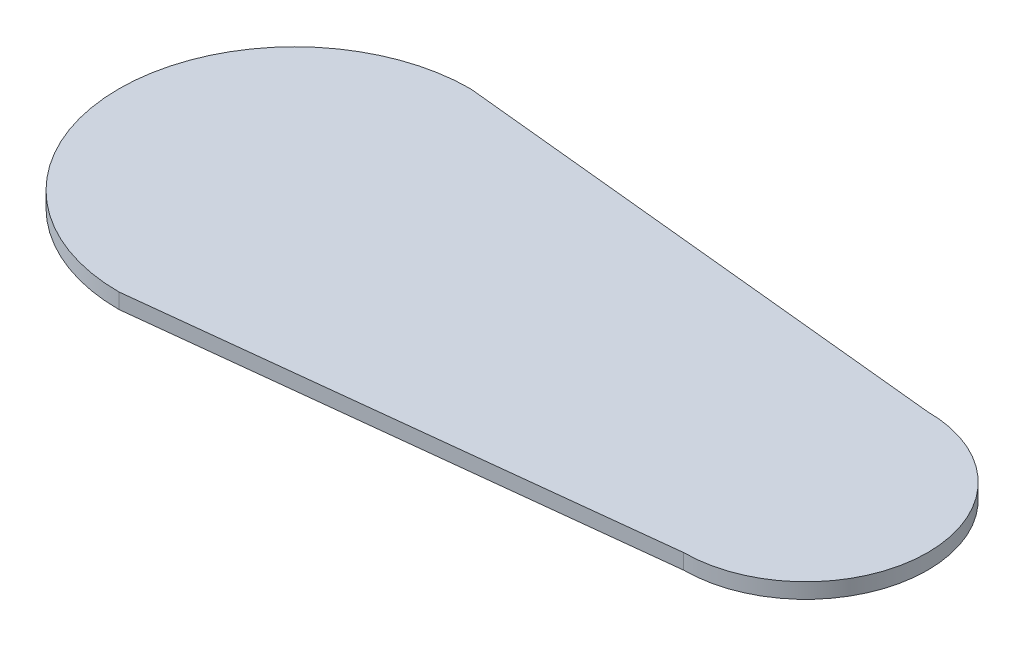
ISO-10303-21;
HEADER;
FILE_DESCRIPTION(('STEP AP214'),'2;1');
FILE_NAME('part.step','',(''),(''),'','','');
FILE_SCHEMA(('AUTOMOTIVE_DESIGN { 1 0 10303 214 1 1 1 1 }'));
ENDSEC;
DATA;
#1=APPLICATION_CONTEXT('core data for automotive mechanical design processes');
#2=APPLICATION_PROTOCOL_DEFINITION('international standard','automotive_design',2000,#1);
#3=PRODUCT_CONTEXT('',#1,'mechanical');
#4=PRODUCT('Part','Part','',(#3));
#5=PRODUCT_RELATED_PRODUCT_CATEGORY('part','',(#4));
#6=PRODUCT_DEFINITION_FORMATION('','',#4);
#7=PRODUCT_DEFINITION_CONTEXT('part definition',#1,'design');
#8=PRODUCT_DEFINITION('design','',#6,#7);
#9=PRODUCT_DEFINITION_SHAPE('','',#8);
#10=(LENGTH_UNIT() NAMED_UNIT(*) SI_UNIT(.MILLI.,.METRE.));
#11=(NAMED_UNIT(*) PLANE_ANGLE_UNIT() SI_UNIT($,.RADIAN.));
#12=(NAMED_UNIT(*) SI_UNIT($,.STERADIAN.) SOLID_ANGLE_UNIT());
#13=UNCERTAINTY_MEASURE_WITH_UNIT(LENGTH_MEASURE(1.E-05),#10,'distance_accuracy_value','');
#14=(GEOMETRIC_REPRESENTATION_CONTEXT(3) GLOBAL_UNCERTAINTY_ASSIGNED_CONTEXT((#13)) GLOBAL_UNIT_ASSIGNED_CONTEXT((#10,
#11,#12)) REPRESENTATION_CONTEXT('',''));
#15=CARTESIAN_POINT('',(0.,0.,0.));
#16=DIRECTION('',(0.,0.,1.));
#17=DIRECTION('',(1.,0.,0.));
#18=AXIS2_PLACEMENT_3D('',#15,#16,#17);
#19=CARTESIAN_POINT('',(0.,3.,-24.));
#20=DIRECTION('',(0.,-1.,0.));
#21=DIRECTION('',(0.,0.,-1.));
#22=AXIS2_PLACEMENT_3D('',#19,#20,#21);
#23=CYLINDRICAL_SURFACE('',#22,24.);
#24=CARTESIAN_POINT('',(0.,0.,-24.));
#25=DIRECTION('',(0.,1.,0.));
#26=DIRECTION('',(0.,0.,-1.));
#27=AXIS2_PLACEMENT_3D('',#24,#25,#26);
#28=CIRCLE('',#27,24.);
#29=CARTESIAN_POINT('',(0.,0.,0.));
#30=VERTEX_POINT('',#29);
#31=CARTESIAN_POINT('',(0.,0.,-48.));
#32=VERTEX_POINT('',#31);
#33=EDGE_CURVE('E96',#30,#32,#28,.T.);
#34=ORIENTED_EDGE('',*,*,#33,.T.);
#35=DIRECTION('',(0.,-1.,0.));
#36=VECTOR('',#35,1.);
#37=CARTESIAN_POINT('',(0.,3.,-48.));
#38=LINE('',#37,#36);
#39=CARTESIAN_POINT('',(0.,3.,-48.));
#40=VERTEX_POINT('',#39);
#41=EDGE_CURVE('E11',#40,#32,#38,.T.);
#42=ORIENTED_EDGE('',*,*,#41,.F.);
#43=CARTESIAN_POINT('',(0.,3.,-24.));
#44=DIRECTION('',(0.,1.,0.));
#45=DIRECTION('',(0.,0.,-1.));
#46=AXIS2_PLACEMENT_3D('',#43,#44,#45);
#47=CIRCLE('',#46,24.);
#48=CARTESIAN_POINT('',(0.,3.,0.));
#49=VERTEX_POINT('',#48);
#50=EDGE_CURVE('E84',#49,#40,#47,.T.);
#51=ORIENTED_EDGE('',*,*,#50,.F.);
#52=DIRECTION('',(0.,-1.,0.));
#53=VECTOR('',#52,1.);
#54=CARTESIAN_POINT('',(0.,3.,0.));
#55=LINE('',#54,#53);
#56=EDGE_CURVE('E92',#49,#30,#55,.T.);
#57=ORIENTED_EDGE('',*,*,#56,.T.);
#58=EDGE_LOOP('',(#34,#42,#51,#57));
#59=FACE_BOUND('',#58,.T.);
#60=ADVANCED_FACE('F33',(#59),#23,.T.);
#61=CARTESIAN_POINT('',(-100.,3.,-58.0615795313177));
#62=DIRECTION('',(-0.10011033594273,0.,0.994976341747599));
#63=DIRECTION('',(0.994976341747599,0.,0.10011033594273));
#64=AXIS2_PLACEMENT_3D('',#61,#62,#63);
#65=PLANE('',#64);
#66=DIRECTION('',(-0.994976341747598,0.,-0.10011033594273));
#67=VECTOR('',#66,1.);
#68=CARTESIAN_POINT('',(-100.,0.,-58.0615795313177));
#69=LINE('',#68,#67);
#70=CARTESIAN_POINT('',(-100.,0.,-58.0615795313177));
#71=VERTEX_POINT('',#70);
#72=EDGE_CURVE('E88',#32,#71,#69,.T.);
#73=ORIENTED_EDGE('',*,*,#72,.T.);
#74=DIRECTION('',(0.,-1.,0.));
#75=VECTOR('',#74,1.);
#76=CARTESIAN_POINT('',(-100.,3.,-58.0615795313177));
#77=LINE('',#76,#75);
#78=CARTESIAN_POINT('',(-100.,3.,-58.0615795313177));
#79=VERTEX_POINT('',#78);
#80=EDGE_CURVE('E41',#79,#71,#77,.T.);
#81=ORIENTED_EDGE('',*,*,#80,.F.);
#82=DIRECTION('',(-0.994976341747598,0.,-0.10011033594273));
#83=VECTOR('',#82,1.);
#84=CARTESIAN_POINT('',(-100.,3.,-58.0615795313177));
#85=LINE('',#84,#83);
#86=EDGE_CURVE('E79',#40,#79,#85,.T.);
#87=ORIENTED_EDGE('',*,*,#86,.F.);
#88=ORIENTED_EDGE('',*,*,#41,.T.);
#89=EDGE_LOOP('',(#73,#81,#87,#88));
#90=FACE_BOUND('',#89,.T.);
#91=ADVANCED_FACE('F87',(#90),#65,.F.);
#92=CARTESIAN_POINT('',(-100.,3.,-23.4579039810428));
#93=DIRECTION('',(0.,-1.,0.));
#94=DIRECTION('',(0.,0.,-1.));
#95=AXIS2_PLACEMENT_3D('',#92,#93,#94);
#96=CYLINDRICAL_SURFACE('',#95,34.6036755502749);
#97=CARTESIAN_POINT('',(-100.,0.,-23.4579039810428));
#98=DIRECTION('',(0.,1.,0.));
#99=DIRECTION('',(0.,0.,1.));
#100=AXIS2_PLACEMENT_3D('',#97,#98,#99);
#101=CIRCLE('',#100,34.6036755502749);
#102=CARTESIAN_POINT('',(-100.,0.,11.1457715692321));
#103=VERTEX_POINT('',#102);
#104=EDGE_CURVE('E66',#71,#103,#101,.T.);
#105=ORIENTED_EDGE('',*,*,#104,.T.);
#106=DIRECTION('',(0.,-1.,0.));
#107=VECTOR('',#106,1.);
#108=CARTESIAN_POINT('',(-100.,3.,11.1457715692321));
#109=LINE('',#108,#107);
#110=CARTESIAN_POINT('',(-100.,3.,11.1457715692321));
#111=VERTEX_POINT('',#110);
#112=EDGE_CURVE('E89',#111,#103,#109,.T.);
#113=ORIENTED_EDGE('',*,*,#112,.F.);
#114=CARTESIAN_POINT('',(-100.,3.,-23.4579039810428));
#115=DIRECTION('',(0.,1.,0.));
#116=DIRECTION('',(0.,0.,1.));
#117=AXIS2_PLACEMENT_3D('',#114,#115,#116);
#118=CIRCLE('',#117,34.6036755502749);
#119=EDGE_CURVE('E82',#79,#111,#118,.T.);
#120=ORIENTED_EDGE('',*,*,#119,.F.);
#121=ORIENTED_EDGE('',*,*,#80,.T.);
#122=EDGE_LOOP('',(#105,#113,#120,#121));
#123=FACE_BOUND('',#122,.T.);
#124=ADVANCED_FACE('F90',(#123),#96,.T.);
#125=CARTESIAN_POINT('',(0.,3.,0.));
#126=DIRECTION('',(-0.110771790261545,0.,-0.993845868574324));
#127=DIRECTION('',(-0.993845868574324,0.,0.110771790261545));
#128=AXIS2_PLACEMENT_3D('',#125,#126,#127);
#129=PLANE('',#128);
#130=DIRECTION('',(0.993845868574324,0.,-0.110771790261545));
#131=VECTOR('',#130,1.);
#132=CARTESIAN_POINT('',(0.,0.,0.));
#133=LINE('',#132,#131);
#134=EDGE_CURVE('E72',#103,#30,#133,.T.);
#135=ORIENTED_EDGE('',*,*,#134,.T.);
#136=ORIENTED_EDGE('',*,*,#56,.F.);
#137=DIRECTION('',(0.993845868574324,0.,-0.110771790261545));
#138=VECTOR('',#137,1.);
#139=CARTESIAN_POINT('',(0.,3.,0.));
#140=LINE('',#139,#138);
#141=EDGE_CURVE('E49',#111,#49,#140,.T.);
#142=ORIENTED_EDGE('',*,*,#141,.F.);
#143=ORIENTED_EDGE('',*,*,#112,.T.);
#144=EDGE_LOOP('',(#135,#136,#142,#143));
#145=FACE_BOUND('',#144,.T.);
#146=ADVANCED_FACE('F103',(#145),#129,.F.);
#147=CARTESIAN_POINT('',(0.,3.,-24.));
#148=DIRECTION('',(0.,-1.,0.));
#149=DIRECTION('',(0.,0.,-1.));
#150=AXIS2_PLACEMENT_3D('',#147,#148,#149);
#151=PLANE('',#150);
#152=ORIENTED_EDGE('',*,*,#50,.T.);
#153=ORIENTED_EDGE('',*,*,#86,.T.);
#154=ORIENTED_EDGE('',*,*,#119,.T.);
#155=ORIENTED_EDGE('',*,*,#141,.T.);
#156=EDGE_LOOP('',(#152,#153,#154,#155));
#157=FACE_BOUND('',#156,.T.);
#158=ADVANCED_FACE('F80',(#157),#151,.F.);
#159=CARTESIAN_POINT('',(0.,0.,-24.));
#160=DIRECTION('',(0.,-1.,0.));
#161=DIRECTION('',(0.,0.,-1.));
#162=AXIS2_PLACEMENT_3D('',#159,#160,#161);
#163=PLANE('',#162);
#164=ORIENTED_EDGE('',*,*,#33,.F.);
#165=ORIENTED_EDGE('',*,*,#134,.F.);
#166=ORIENTED_EDGE('',*,*,#104,.F.);
#167=ORIENTED_EDGE('',*,*,#72,.F.);
#168=EDGE_LOOP('',(#164,#165,#166,#167));
#169=FACE_BOUND('',#168,.T.);
#170=ADVANCED_FACE('F106',(#169),#163,.T.);
#171=CLOSED_SHELL('',(#60,#91,#124,#146,#158,#170));
#172=MANIFOLD_SOLID_BREP('B2',#171);
#173=ADVANCED_BREP_SHAPE_REPRESENTATION('',(#18,#172),#14);
#174=SHAPE_DEFINITION_REPRESENTATION(#9,#173);
ENDSEC;
END-ISO-10303-21;
